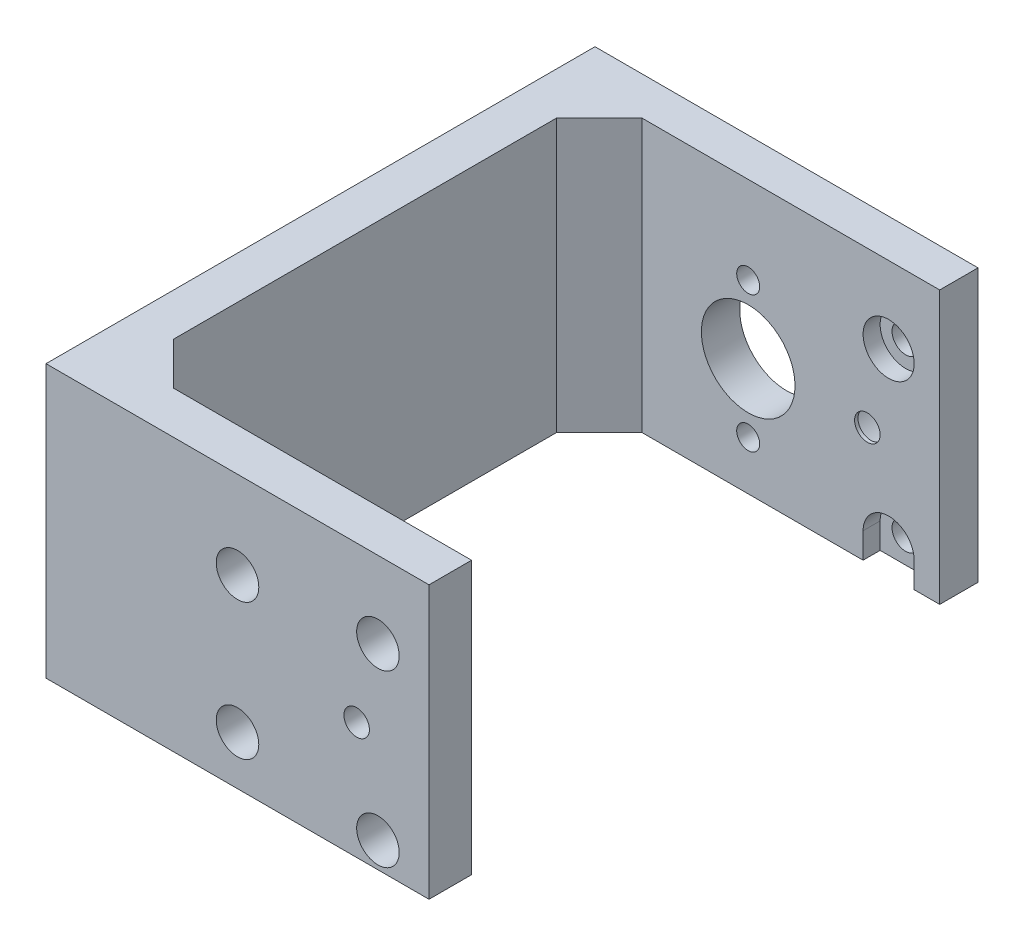
ISO-10303-21;
HEADER;
FILE_DESCRIPTION(('STEP AP214'),'2;1');
FILE_NAME('part.step','',(''),(''),'','','');
FILE_SCHEMA(('AUTOMOTIVE_DESIGN { 1 0 10303 214 1 1 1 1 }'));
ENDSEC;
DATA;
#1=APPLICATION_CONTEXT('core data for automotive mechanical design processes');
#2=APPLICATION_PROTOCOL_DEFINITION('international standard','automotive_design',2000,#1);
#3=PRODUCT_CONTEXT('',#1,'mechanical');
#4=PRODUCT('Part','Part','',(#3));
#5=PRODUCT_RELATED_PRODUCT_CATEGORY('part','',(#4));
#6=PRODUCT_DEFINITION_FORMATION('','',#4);
#7=PRODUCT_DEFINITION_CONTEXT('part definition',#1,'design');
#8=PRODUCT_DEFINITION('design','',#6,#7);
#9=PRODUCT_DEFINITION_SHAPE('','',#8);
#10=(LENGTH_UNIT() NAMED_UNIT(*) SI_UNIT(.MILLI.,.METRE.));
#11=(NAMED_UNIT(*) PLANE_ANGLE_UNIT() SI_UNIT($,.RADIAN.));
#12=(NAMED_UNIT(*) SI_UNIT($,.STERADIAN.) SOLID_ANGLE_UNIT());
#13=UNCERTAINTY_MEASURE_WITH_UNIT(LENGTH_MEASURE(1.E-05),#10,'distance_accuracy_value','');
#14=(GEOMETRIC_REPRESENTATION_CONTEXT(3) GLOBAL_UNCERTAINTY_ASSIGNED_CONTEXT((#13)) GLOBAL_UNIT_ASSIGNED_CONTEXT((#10,
#11,#12)) REPRESENTATION_CONTEXT('',''));
#15=CARTESIAN_POINT('',(0.,0.,0.));
#16=DIRECTION('',(0.,0.,1.));
#17=DIRECTION('',(1.,0.,0.));
#18=AXIS2_PLACEMENT_3D('',#15,#16,#17);
#19=CARTESIAN_POINT('',(-7.5,0.,64.5));
#20=DIRECTION('',(-1.,0.,0.));
#21=DIRECTION('',(0.,0.,1.));
#22=AXIS2_PLACEMENT_3D('',#19,#20,#21);
#23=PLANE('',#22);
#24=DIRECTION('',(0.,0.,-1.));
#25=VECTOR('',#24,1.);
#26=CARTESIAN_POINT('',(-7.5,32.,64.5));
#27=LINE('',#26,#25);
#28=CARTESIAN_POINT('',(-7.5,32.,54.5));
#29=VERTEX_POINT('',#28);
#30=CARTESIAN_POINT('',(-7.5,32.,9.50000000000004));
#31=VERTEX_POINT('',#30);
#32=EDGE_CURVE('E183',#29,#31,#27,.T.);
#33=ORIENTED_EDGE('',*,*,#32,.F.);
#34=DIRECTION('',(0.,-1.,0.));
#35=VECTOR('',#34,1.);
#36=CARTESIAN_POINT('',(-7.5,0.,54.5));
#37=LINE('',#36,#35);
#38=CARTESIAN_POINT('',(-7.5,0.,54.5));
#39=VERTEX_POINT('',#38);
#40=EDGE_CURVE('E296',#29,#39,#37,.T.);
#41=ORIENTED_EDGE('',*,*,#40,.T.);
#42=DIRECTION('',(0.,0.,-1.));
#43=VECTOR('',#42,1.);
#44=CARTESIAN_POINT('',(-7.5,0.,64.5));
#45=LINE('',#44,#43);
#46=CARTESIAN_POINT('',(-7.5,0.,9.50000000000004));
#47=VERTEX_POINT('',#46);
#48=EDGE_CURVE('E187',#39,#47,#45,.T.);
#49=ORIENTED_EDGE('',*,*,#48,.T.);
#50=DIRECTION('',(0.,1.,0.));
#51=VECTOR('',#50,1.);
#52=CARTESIAN_POINT('',(-7.5,0.,9.50000000000004));
#53=LINE('',#52,#51);
#54=EDGE_CURVE('E294',#47,#31,#53,.T.);
#55=ORIENTED_EDGE('',*,*,#54,.T.);
#56=EDGE_LOOP('',(#33,#41,#49,#55));
#57=FACE_BOUND('',#56,.T.);
#58=ADVANCED_FACE('F41',(#57),#23,.F.);
#59=CARTESIAN_POINT('',(26.5,3.,-5.5));
#60=DIRECTION('',(0.,0.,1.));
#61=DIRECTION('',(1.,0.,0.));
#62=AXIS2_PLACEMENT_3D('',#59,#60,#61);
#63=CYLINDRICAL_SURFACE('',#62,1.6);
#64=CARTESIAN_POINT('',(26.5,3.,0.));
#65=DIRECTION('',(0.,0.,1.));
#66=DIRECTION('',(1.,0.,0.));
#67=AXIS2_PLACEMENT_3D('',#64,#65,#66);
#68=CIRCLE('',#67,1.6);
#69=CARTESIAN_POINT('',(28.1,3.,0.));
#70=VERTEX_POINT('',#69);
#71=EDGE_CURVE('E279',#70,#70,#68,.T.);
#72=ORIENTED_EDGE('',*,*,#71,.F.);
#73=EDGE_LOOP('',(#72));
#74=FACE_BOUND('',#73,.T.);
#75=CARTESIAN_POINT('',(26.5,3.,2.5));
#76=DIRECTION('',(0.,0.,1.));
#77=DIRECTION('',(1.,0.,0.));
#78=AXIS2_PLACEMENT_3D('',#75,#76,#77);
#79=CIRCLE('',#78,1.6);
#80=CARTESIAN_POINT('',(28.1,3.,2.5));
#81=VERTEX_POINT('',#80);
#82=EDGE_CURVE('E229',#81,#81,#79,.F.);
#83=ORIENTED_EDGE('',*,*,#82,.F.);
#84=EDGE_LOOP('',(#83));
#85=FACE_BOUND('',#84,.T.);
#86=ADVANCED_FACE('F360',(#74,#85),#63,.F.);
#87=CARTESIAN_POINT('',(26.5,23.,-5.5));
#88=DIRECTION('',(0.,0.,1.));
#89=DIRECTION('',(1.,0.,0.));
#90=AXIS2_PLACEMENT_3D('',#87,#88,#89);
#91=CYLINDRICAL_SURFACE('',#90,1.6);
#92=CARTESIAN_POINT('',(26.5,23.,0.));
#93=DIRECTION('',(0.,0.,1.));
#94=DIRECTION('',(1.,0.,0.));
#95=AXIS2_PLACEMENT_3D('',#92,#93,#94);
#96=CIRCLE('',#95,1.6);
#97=CARTESIAN_POINT('',(28.1,23.,0.));
#98=VERTEX_POINT('',#97);
#99=EDGE_CURVE('E248',#98,#98,#96,.T.);
#100=ORIENTED_EDGE('',*,*,#99,.F.);
#101=EDGE_LOOP('',(#100));
#102=FACE_BOUND('',#101,.T.);
#103=CARTESIAN_POINT('',(26.5,23.,2.5));
#104=DIRECTION('',(0.,0.,1.));
#105=DIRECTION('',(1.,0.,0.));
#106=AXIS2_PLACEMENT_3D('',#103,#104,#105);
#107=CIRCLE('',#106,1.6);
#108=CARTESIAN_POINT('',(28.1,23.,2.5));
#109=VERTEX_POINT('',#108);
#110=EDGE_CURVE('E191',#109,#109,#107,.F.);
#111=ORIENTED_EDGE('',*,*,#110,.F.);
#112=EDGE_LOOP('',(#111));
#113=FACE_BOUND('',#112,.T.);
#114=ADVANCED_FACE('F366',(#102,#113),#91,.F.);
#115=CARTESIAN_POINT('',(24.,13.75,4.5));
#116=DIRECTION('',(0.,0.,-1.));
#117=DIRECTION('',(-1.,0.,0.));
#118=AXIS2_PLACEMENT_3D('',#115,#116,#117);
#119=CYLINDRICAL_SURFACE('',#118,4.45);
#120=CARTESIAN_POINT('',(24.,13.75,0.));
#121=DIRECTION('',(0.,0.,1.));
#122=DIRECTION('',(1.,0.,0.));
#123=AXIS2_PLACEMENT_3D('',#120,#121,#122);
#124=CIRCLE('',#123,4.45);
#125=CARTESIAN_POINT('',(28.45,13.75,0.));
#126=VERTEX_POINT('',#125);
#127=EDGE_CURVE('E255',#126,#126,#124,.T.);
#128=ORIENTED_EDGE('',*,*,#127,.F.);
#129=EDGE_LOOP('',(#128));
#130=FACE_BOUND('',#129,.T.);
#131=CARTESIAN_POINT('',(24.,13.75,4.1));
#132=DIRECTION('',(0.,0.,1.));
#133=DIRECTION('',(1.,0.,0.));
#134=AXIS2_PLACEMENT_3D('',#131,#132,#133);
#135=CIRCLE('',#134,4.45);
#136=CARTESIAN_POINT('',(28.45,13.75,4.1));
#137=VERTEX_POINT('',#136);
#138=EDGE_CURVE('E244',#137,#137,#135,.T.);
#139=ORIENTED_EDGE('',*,*,#138,.T.);
#140=EDGE_LOOP('',(#139));
#141=FACE_BOUND('',#140,.T.);
#142=ADVANCED_FACE('F405',(#130,#141),#119,.F.);
#143=CARTESIAN_POINT('',(0.,0.,4.5));
#144=DIRECTION('',(0.,0.,1.));
#145=DIRECTION('',(1.,0.,0.));
#146=AXIS2_PLACEMENT_3D('',#143,#144,#145);
#147=PLANE('',#146);
#148=DIRECTION('',(-1.,0.,0.));
#149=VECTOR('',#148,1.);
#150=CARTESIAN_POINT('',(-12.5,32.,4.5));
#151=LINE('',#150,#149);
#152=CARTESIAN_POINT('',(32.5,32.,4.5));
#153=VERTEX_POINT('',#152);
#154=CARTESIAN_POINT('',(-2.50000000000001,32.,4.5));
#155=VERTEX_POINT('',#154);
#156=EDGE_CURVE('E226',#153,#155,#151,.T.);
#157=ORIENTED_EDGE('',*,*,#156,.T.);
#158=DIRECTION('',(0.,-1.,0.));
#159=VECTOR('',#158,1.);
#160=CARTESIAN_POINT('',(-2.50000000000001,0.,4.5));
#161=LINE('',#160,#159);
#162=CARTESIAN_POINT('',(-2.50000000000001,0.,4.5));
#163=VERTEX_POINT('',#162);
#164=EDGE_CURVE('E61',#155,#163,#161,.T.);
#165=ORIENTED_EDGE('',*,*,#164,.T.);
#166=DIRECTION('',(1.,0.,0.));
#167=VECTOR('',#166,1.);
#168=CARTESIAN_POINT('',(-12.5,0.,4.5));
#169=LINE('',#168,#167);
#170=CARTESIAN_POINT('',(23.5,0.,4.5));
#171=VERTEX_POINT('',#170);
#172=EDGE_CURVE('E265',#163,#171,#169,.T.);
#173=ORIENTED_EDGE('',*,*,#172,.T.);
#174=DIRECTION('',(0.,-1.,0.));
#175=VECTOR('',#174,1.);
#176=CARTESIAN_POINT('',(23.5,3.,4.5));
#177=LINE('',#176,#175);
#178=CARTESIAN_POINT('',(23.5,3.,4.5));
#179=VERTEX_POINT('',#178);
#180=EDGE_CURVE('E208',#179,#171,#177,.T.);
#181=ORIENTED_EDGE('',*,*,#180,.F.);
#182=CARTESIAN_POINT('',(26.5,3.,4.5));
#183=DIRECTION('',(0.,0.,1.));
#184=DIRECTION('',(1.,0.,0.));
#185=AXIS2_PLACEMENT_3D('',#182,#183,#184);
#186=CIRCLE('',#185,3.);
#187=CARTESIAN_POINT('',(29.5,3.,4.5));
#188=VERTEX_POINT('',#187);
#189=EDGE_CURVE('E200',#188,#179,#186,.T.);
#190=ORIENTED_EDGE('',*,*,#189,.F.);
#191=DIRECTION('',(0.,1.,0.));
#192=VECTOR('',#191,1.);
#193=CARTESIAN_POINT('',(29.5,0.,4.5));
#194=LINE('',#193,#192);
#195=CARTESIAN_POINT('',(29.5,0.,4.5));
#196=VERTEX_POINT('',#195);
#197=EDGE_CURVE('E210',#196,#188,#194,.T.);
#198=ORIENTED_EDGE('',*,*,#197,.F.);
#199=CARTESIAN_POINT('',(32.5,0.,4.5));
#200=VERTEX_POINT('',#199);
#201=EDGE_CURVE('E264',#196,#200,#169,.T.);
#202=ORIENTED_EDGE('',*,*,#201,.T.);
#203=DIRECTION('',(0.,1.,0.));
#204=VECTOR('',#203,1.);
#205=CARTESIAN_POINT('',(32.5,27.5,4.5));
#206=LINE('',#205,#204);
#207=EDGE_CURVE('E262',#200,#153,#206,.T.);
#208=ORIENTED_EDGE('',*,*,#207,.T.);
#209=EDGE_LOOP('',(#157,#165,#173,#181,#190,#198,#202,#208));
#210=FACE_BOUND('',#209,.T.);
#211=CARTESIAN_POINT('',(26.5,23.,4.5));
#212=DIRECTION('',(0.,0.,1.));
#213=DIRECTION('',(1.,0.,0.));
#214=AXIS2_PLACEMENT_3D('',#211,#212,#213);
#215=CIRCLE('',#214,3.);
#216=CARTESIAN_POINT('',(29.5,23.,4.5));
#217=VERTEX_POINT('',#216);
#218=EDGE_CURVE('E194',#217,#217,#215,.T.);
#219=ORIENTED_EDGE('',*,*,#218,.F.);
#220=EDGE_LOOP('',(#219));
#221=FACE_BOUND('',#220,.T.);
#222=CARTESIAN_POINT('',(10.,21.75,4.5));
#223=DIRECTION('',(0.,0.,1.));
#224=DIRECTION('',(1.,0.,0.));
#225=AXIS2_PLACEMENT_3D('',#222,#223,#224);
#226=CIRCLE('',#225,1.35);
#227=CARTESIAN_POINT('',(11.35,21.75,4.5));
#228=VERTEX_POINT('',#227);
#229=EDGE_CURVE('E236',#228,#228,#226,.T.);
#230=ORIENTED_EDGE('',*,*,#229,.F.);
#231=EDGE_LOOP('',(#230));
#232=FACE_BOUND('',#231,.T.);
#233=CARTESIAN_POINT('',(10.,5.75,4.5));
#234=DIRECTION('',(0.,0.,1.));
#235=DIRECTION('',(1.,0.,0.));
#236=AXIS2_PLACEMENT_3D('',#233,#234,#235);
#237=CIRCLE('',#236,1.35);
#238=CARTESIAN_POINT('',(11.35,5.75,4.5));
#239=VERTEX_POINT('',#238);
#240=EDGE_CURVE('E231',#239,#239,#237,.T.);
#241=ORIENTED_EDGE('',*,*,#240,.F.);
#242=EDGE_LOOP('',(#241));
#243=FACE_BOUND('',#242,.T.);
#244=CARTESIAN_POINT('',(10.,13.75,4.5));
#245=DIRECTION('',(0.,0.,1.));
#246=DIRECTION('',(1.,0.,0.));
#247=AXIS2_PLACEMENT_3D('',#244,#245,#246);
#248=CIRCLE('',#247,5.5);
#249=CARTESIAN_POINT('',(15.5,13.75,4.5));
#250=VERTEX_POINT('',#249);
#251=EDGE_CURVE('E258',#250,#250,#248,.T.);
#252=ORIENTED_EDGE('',*,*,#251,.F.);
#253=EDGE_LOOP('',(#252));
#254=FACE_BOUND('',#253,.T.);
#255=CARTESIAN_POINT('',(24.,13.75,4.5));
#256=DIRECTION('',(0.,0.,1.));
#257=DIRECTION('',(1.,0.,0.));
#258=AXIS2_PLACEMENT_3D('',#255,#256,#257);
#259=CIRCLE('',#258,1.5);
#260=CARTESIAN_POINT('',(25.5,13.75,4.5));
#261=VERTEX_POINT('',#260);
#262=EDGE_CURVE('E246',#261,#261,#259,.T.);
#263=ORIENTED_EDGE('',*,*,#262,.F.);
#264=EDGE_LOOP('',(#263));
#265=FACE_BOUND('',#264,.T.);
#266=ADVANCED_FACE('F323',(#210,#221,#232,#243,#254,#265),#147,.T.);
#267=CARTESIAN_POINT('',(0.,0.,0.));
#268=DIRECTION('',(0.,0.,1.));
#269=DIRECTION('',(1.,0.,0.));
#270=AXIS2_PLACEMENT_3D('',#267,#268,#269);
#271=PLANE('',#270);
#272=CARTESIAN_POINT('',(10.,21.75,0.));
#273=DIRECTION('',(0.,0.,1.));
#274=DIRECTION('',(1.,0.,0.));
#275=AXIS2_PLACEMENT_3D('',#272,#273,#274);
#276=CIRCLE('',#275,1.35);
#277=CARTESIAN_POINT('',(11.35,21.75,0.));
#278=VERTEX_POINT('',#277);
#279=EDGE_CURVE('E285',#278,#278,#276,.T.);
#280=ORIENTED_EDGE('',*,*,#279,.T.);
#281=EDGE_LOOP('',(#280));
#282=FACE_BOUND('',#281,.T.);
#283=CARTESIAN_POINT('',(10.,5.75,0.));
#284=DIRECTION('',(0.,0.,1.));
#285=DIRECTION('',(1.,0.,0.));
#286=AXIS2_PLACEMENT_3D('',#283,#284,#285);
#287=CIRCLE('',#286,1.35);
#288=CARTESIAN_POINT('',(11.35,5.75,0.));
#289=VERTEX_POINT('',#288);
#290=EDGE_CURVE('E237',#289,#289,#287,.T.);
#291=ORIENTED_EDGE('',*,*,#290,.T.);
#292=EDGE_LOOP('',(#291));
#293=FACE_BOUND('',#292,.T.);
#294=ORIENTED_EDGE('',*,*,#99,.T.);
#295=EDGE_LOOP('',(#294));
#296=FACE_BOUND('',#295,.T.);
#297=ORIENTED_EDGE('',*,*,#71,.T.);
#298=EDGE_LOOP('',(#297));
#299=FACE_BOUND('',#298,.T.);
#300=DIRECTION('',(0.,-1.,0.));
#301=VECTOR('',#300,1.);
#302=CARTESIAN_POINT('',(-12.5,27.5,0.));
#303=LINE('',#302,#301);
#304=CARTESIAN_POINT('',(-12.5,32.,0.));
#305=VERTEX_POINT('',#304);
#306=CARTESIAN_POINT('',(-12.5,0.,0.));
#307=VERTEX_POINT('',#306);
#308=EDGE_CURVE('E259',#305,#307,#303,.T.);
#309=ORIENTED_EDGE('',*,*,#308,.F.);
#310=DIRECTION('',(-1.,0.,0.));
#311=VECTOR('',#310,1.);
#312=CARTESIAN_POINT('',(-12.5,32.,0.));
#313=LINE('',#312,#311);
#314=CARTESIAN_POINT('',(32.5,32.,0.));
#315=VERTEX_POINT('',#314);
#316=EDGE_CURVE('E221',#315,#305,#313,.T.);
#317=ORIENTED_EDGE('',*,*,#316,.F.);
#318=DIRECTION('',(0.,1.,0.));
#319=VECTOR('',#318,1.);
#320=CARTESIAN_POINT('',(32.5,27.5,0.));
#321=LINE('',#320,#319);
#322=CARTESIAN_POINT('',(32.5,0.,0.));
#323=VERTEX_POINT('',#322);
#324=EDGE_CURVE('E275',#323,#315,#321,.T.);
#325=ORIENTED_EDGE('',*,*,#324,.F.);
#326=DIRECTION('',(1.,0.,0.));
#327=VECTOR('',#326,1.);
#328=CARTESIAN_POINT('',(0.,0.,0.));
#329=LINE('',#328,#327);
#330=EDGE_CURVE('E268',#307,#323,#329,.T.);
#331=ORIENTED_EDGE('',*,*,#330,.F.);
#332=EDGE_LOOP('',(#309,#317,#325,#331));
#333=FACE_BOUND('',#332,.T.);
#334=CARTESIAN_POINT('',(10.,13.75,0.));
#335=DIRECTION('',(0.,0.,1.));
#336=DIRECTION('',(1.,0.,0.));
#337=AXIS2_PLACEMENT_3D('',#334,#335,#336);
#338=CIRCLE('',#337,5.5);
#339=CARTESIAN_POINT('',(15.5,13.75,0.));
#340=VERTEX_POINT('',#339);
#341=EDGE_CURVE('E253',#340,#340,#338,.T.);
#342=ORIENTED_EDGE('',*,*,#341,.T.);
#343=EDGE_LOOP('',(#342));
#344=FACE_BOUND('',#343,.T.);
#345=ORIENTED_EDGE('',*,*,#127,.T.);
#346=EDGE_LOOP('',(#345));
#347=FACE_BOUND('',#346,.T.);
#348=ADVANCED_FACE('F345',(#282,#293,#296,#299,#333,#344,#347),#271,.F.);
#349=CARTESIAN_POINT('',(-12.5,27.5,4.5));
#350=DIRECTION('',(1.,0.,0.));
#351=DIRECTION('',(0.,1.,0.));
#352=AXIS2_PLACEMENT_3D('',#349,#350,#351);
#353=PLANE('',#352);
#354=ORIENTED_EDGE('',*,*,#308,.T.);
#355=DIRECTION('',(0.,0.,-1.));
#356=VECTOR('',#355,1.);
#357=CARTESIAN_POINT('',(-12.5,0.,4.5));
#358=LINE('',#357,#356);
#359=CARTESIAN_POINT('',(-12.5,0.,64.5));
#360=VERTEX_POINT('',#359);
#361=EDGE_CURVE('E278',#360,#307,#358,.T.);
#362=ORIENTED_EDGE('',*,*,#361,.F.);
#363=DIRECTION('',(0.,-1.,0.));
#364=VECTOR('',#363,1.);
#365=CARTESIAN_POINT('',(-12.5,0.,64.5));
#366=LINE('',#365,#364);
#367=CARTESIAN_POINT('',(-12.5,32.,64.5));
#368=VERTEX_POINT('',#367);
#369=EDGE_CURVE('E147',#368,#360,#366,.T.);
#370=ORIENTED_EDGE('',*,*,#369,.F.);
#371=DIRECTION('',(0.,0.,1.));
#372=VECTOR('',#371,1.);
#373=CARTESIAN_POINT('',(-12.5,32.,0.));
#374=LINE('',#373,#372);
#375=EDGE_CURVE('E233',#305,#368,#374,.T.);
#376=ORIENTED_EDGE('',*,*,#375,.F.);
#377=EDGE_LOOP('',(#354,#362,#370,#376));
#378=FACE_BOUND('',#377,.T.);
#379=ADVANCED_FACE('F346',(#378),#353,.F.);
#380=CARTESIAN_POINT('',(0.,0.,4.5));
#381=DIRECTION('',(0.,1.,0.));
#382=DIRECTION('',(-1.,0.,0.));
#383=AXIS2_PLACEMENT_3D('',#380,#381,#382);
#384=PLANE('',#383);
#385=DIRECTION('',(1.,0.,0.));
#386=VECTOR('',#385,1.);
#387=CARTESIAN_POINT('',(23.5,0.,2.5));
#388=LINE('',#387,#386);
#389=CARTESIAN_POINT('',(23.5,0.,2.5));
#390=VERTEX_POINT('',#389);
#391=CARTESIAN_POINT('',(29.5,0.,2.5));
#392=VERTEX_POINT('',#391);
#393=EDGE_CURVE('E218',#390,#392,#388,.T.);
#394=ORIENTED_EDGE('',*,*,#393,.F.);
#395=DIRECTION('',(0.,0.,1.));
#396=VECTOR('',#395,1.);
#397=CARTESIAN_POINT('',(23.5,0.,2.5));
#398=LINE('',#397,#396);
#399=EDGE_CURVE('E202',#390,#171,#398,.T.);
#400=ORIENTED_EDGE('',*,*,#399,.T.);
#401=ORIENTED_EDGE('',*,*,#172,.F.);
#402=DIRECTION('',(-0.707106781186544,0.,0.707106781186551));
#403=VECTOR('',#402,1.);
#404=CARTESIAN_POINT('',(-1.25000000000002,0.,3.24999999999999));
#405=LINE('',#404,#403);
#406=EDGE_CURVE('E11',#163,#47,#405,.T.);
#407=ORIENTED_EDGE('',*,*,#406,.T.);
#408=ORIENTED_EDGE('',*,*,#48,.F.);
#409=DIRECTION('',(-0.707106781186551,0.,-0.707106781186544));
#410=VECTOR('',#409,1.);
#411=CARTESIAN_POINT('',(-28.75,0.,33.2500000000002));
#412=LINE('',#411,#410);
#413=CARTESIAN_POINT('',(-2.49999999999998,0.,59.5));
#414=VERTEX_POINT('',#413);
#415=EDGE_CURVE('E303',#39,#414,#412,.F.);
#416=ORIENTED_EDGE('',*,*,#415,.T.);
#417=DIRECTION('',(-1.,0.,0.));
#418=VECTOR('',#417,1.);
#419=CARTESIAN_POINT('',(32.5,0.,59.5));
#420=LINE('',#419,#418);
#421=CARTESIAN_POINT('',(32.5,0.,59.5));
#422=VERTEX_POINT('',#421);
#423=EDGE_CURVE('E158',#422,#414,#420,.T.);
#424=ORIENTED_EDGE('',*,*,#423,.F.);
#425=DIRECTION('',(0.,0.,-1.));
#426=VECTOR('',#425,1.);
#427=CARTESIAN_POINT('',(32.5,0.,64.5));
#428=LINE('',#427,#426);
#429=CARTESIAN_POINT('',(32.5,0.,64.5));
#430=VERTEX_POINT('',#429);
#431=EDGE_CURVE('E157',#430,#422,#428,.T.);
#432=ORIENTED_EDGE('',*,*,#431,.F.);
#433=DIRECTION('',(1.,0.,0.));
#434=VECTOR('',#433,1.);
#435=CARTESIAN_POINT('',(-12.5,0.,64.5));
#436=LINE('',#435,#434);
#437=EDGE_CURVE('E141',#360,#430,#436,.T.);
#438=ORIENTED_EDGE('',*,*,#437,.F.);
#439=ORIENTED_EDGE('',*,*,#361,.T.);
#440=ORIENTED_EDGE('',*,*,#330,.T.);
#441=DIRECTION('',(0.,0.,-1.));
#442=VECTOR('',#441,1.);
#443=CARTESIAN_POINT('',(32.5,0.,4.5));
#444=LINE('',#443,#442);
#445=EDGE_CURVE('E269',#200,#323,#444,.T.);
#446=ORIENTED_EDGE('',*,*,#445,.F.);
#447=ORIENTED_EDGE('',*,*,#201,.F.);
#448=DIRECTION('',(0.,0.,1.));
#449=VECTOR('',#448,1.);
#450=CARTESIAN_POINT('',(29.5,0.,2.5));
#451=LINE('',#450,#449);
#452=EDGE_CURVE('E201',#392,#196,#451,.T.);
#453=ORIENTED_EDGE('',*,*,#452,.F.);
#454=EDGE_LOOP('',(#394,#400,#401,#407,#408,#416,#424,#432,#438,#439,#440,#446,#447,#453));
#455=FACE_BOUND('',#454,.T.);
#456=ADVANCED_FACE('F160',(#455),#384,.F.);
#457=CARTESIAN_POINT('',(32.5,27.5,4.5));
#458=DIRECTION('',(-1.,0.,0.));
#459=DIRECTION('',(0.,-1.,0.));
#460=AXIS2_PLACEMENT_3D('',#457,#458,#459);
#461=PLANE('',#460);
#462=ORIENTED_EDGE('',*,*,#324,.T.);
#463=DIRECTION('',(0.,0.,1.));
#464=VECTOR('',#463,1.);
#465=CARTESIAN_POINT('',(32.5,32.,0.));
#466=LINE('',#465,#464);
#467=EDGE_CURVE('E227',#315,#153,#466,.T.);
#468=ORIENTED_EDGE('',*,*,#467,.T.);
#469=ORIENTED_EDGE('',*,*,#207,.F.);
#470=ORIENTED_EDGE('',*,*,#445,.T.);
#471=EDGE_LOOP('',(#462,#468,#469,#470));
#472=FACE_BOUND('',#471,.T.);
#473=ADVANCED_FACE('F336',(#472),#461,.F.);
#474=CARTESIAN_POINT('',(10.,13.75,4.5));
#475=DIRECTION('',(0.,0.,-1.));
#476=DIRECTION('',(-1.,0.,0.));
#477=AXIS2_PLACEMENT_3D('',#474,#475,#476);
#478=CYLINDRICAL_SURFACE('',#477,5.5);
#479=ORIENTED_EDGE('',*,*,#251,.T.);
#480=EDGE_LOOP('',(#479));
#481=FACE_BOUND('',#480,.T.);
#482=ORIENTED_EDGE('',*,*,#341,.F.);
#483=EDGE_LOOP('',(#482));
#484=FACE_BOUND('',#483,.T.);
#485=ADVANCED_FACE('F411',(#481,#484),#478,.F.);
#486=CARTESIAN_POINT('',(24.,13.75,4.1));
#487=DIRECTION('',(0.,0.,1.));
#488=DIRECTION('',(1.,0.,0.));
#489=AXIS2_PLACEMENT_3D('',#486,#487,#488);
#490=PLANE('',#489);
#491=CARTESIAN_POINT('',(24.,13.75,4.1));
#492=DIRECTION('',(0.,0.,1.));
#493=DIRECTION('',(1.,0.,0.));
#494=AXIS2_PLACEMENT_3D('',#491,#492,#493);
#495=CIRCLE('',#494,1.5);
#496=CARTESIAN_POINT('',(25.5,13.75,4.1));
#497=VERTEX_POINT('',#496);
#498=EDGE_CURVE('E245',#497,#497,#495,.T.);
#499=ORIENTED_EDGE('',*,*,#498,.T.);
#500=EDGE_LOOP('',(#499));
#501=FACE_BOUND('',#500,.T.);
#502=ORIENTED_EDGE('',*,*,#138,.F.);
#503=EDGE_LOOP('',(#502));
#504=FACE_BOUND('',#503,.T.);
#505=ADVANCED_FACE('F410',(#501,#504),#490,.F.);
#506=CARTESIAN_POINT('',(24.,13.75,4.1));
#507=DIRECTION('',(0.,0.,1.));
#508=DIRECTION('',(1.,0.,0.));
#509=AXIS2_PLACEMENT_3D('',#506,#507,#508);
#510=CYLINDRICAL_SURFACE('',#509,1.5);
#511=ORIENTED_EDGE('',*,*,#498,.F.);
#512=EDGE_LOOP('',(#511));
#513=FACE_BOUND('',#512,.T.);
#514=ORIENTED_EDGE('',*,*,#262,.T.);
#515=EDGE_LOOP('',(#514));
#516=FACE_BOUND('',#515,.T.);
#517=ADVANCED_FACE('F396',(#513,#516),#510,.F.);
#518=CARTESIAN_POINT('',(10.,5.75,-5.5));
#519=DIRECTION('',(0.,0.,1.));
#520=DIRECTION('',(1.,0.,0.));
#521=AXIS2_PLACEMENT_3D('',#518,#519,#520);
#522=CYLINDRICAL_SURFACE('',#521,1.35);
#523=ORIENTED_EDGE('',*,*,#240,.T.);
#524=EDGE_LOOP('',(#523));
#525=FACE_BOUND('',#524,.T.);
#526=ORIENTED_EDGE('',*,*,#290,.F.);
#527=EDGE_LOOP('',(#526));
#528=FACE_BOUND('',#527,.T.);
#529=ADVANCED_FACE('F394',(#525,#528),#522,.F.);
#530=CARTESIAN_POINT('',(10.,21.75,-5.5));
#531=DIRECTION('',(0.,0.,1.));
#532=DIRECTION('',(1.,0.,0.));
#533=AXIS2_PLACEMENT_3D('',#530,#531,#532);
#534=CYLINDRICAL_SURFACE('',#533,1.35);
#535=ORIENTED_EDGE('',*,*,#229,.T.);
#536=EDGE_LOOP('',(#535));
#537=FACE_BOUND('',#536,.T.);
#538=ORIENTED_EDGE('',*,*,#279,.F.);
#539=EDGE_LOOP('',(#538));
#540=FACE_BOUND('',#539,.T.);
#541=ADVANCED_FACE('F395',(#537,#540),#534,.F.);
#542=CARTESIAN_POINT('',(-12.5,32.,0.));
#543=DIRECTION('',(0.,1.,0.));
#544=DIRECTION('',(0.,0.,1.));
#545=AXIS2_PLACEMENT_3D('',#542,#543,#544);
#546=PLANE('',#545);
#547=ORIENTED_EDGE('',*,*,#156,.F.);
#548=ORIENTED_EDGE('',*,*,#467,.F.);
#549=ORIENTED_EDGE('',*,*,#316,.T.);
#550=ORIENTED_EDGE('',*,*,#375,.T.);
#551=DIRECTION('',(-1.,0.,0.));
#552=VECTOR('',#551,1.);
#553=CARTESIAN_POINT('',(-12.5,32.,64.5));
#554=LINE('',#553,#552);
#555=CARTESIAN_POINT('',(32.5,32.,64.5));
#556=VERTEX_POINT('',#555);
#557=EDGE_CURVE('E153',#556,#368,#554,.T.);
#558=ORIENTED_EDGE('',*,*,#557,.F.);
#559=DIRECTION('',(0.,0.,1.));
#560=VECTOR('',#559,1.);
#561=CARTESIAN_POINT('',(32.5,32.,64.5));
#562=LINE('',#561,#560);
#563=CARTESIAN_POINT('',(32.5,32.,59.5));
#564=VERTEX_POINT('',#563);
#565=EDGE_CURVE('E166',#564,#556,#562,.T.);
#566=ORIENTED_EDGE('',*,*,#565,.F.);
#567=DIRECTION('',(-1.,0.,0.));
#568=VECTOR('',#567,1.);
#569=CARTESIAN_POINT('',(32.5,32.,59.5));
#570=LINE('',#569,#568);
#571=CARTESIAN_POINT('',(-2.49999999999998,32.,59.5));
#572=VERTEX_POINT('',#571);
#573=EDGE_CURVE('E178',#564,#572,#570,.T.);
#574=ORIENTED_EDGE('',*,*,#573,.T.);
#575=DIRECTION('',(0.707106781186551,0.,0.707106781186544));
#576=VECTOR('',#575,1.);
#577=CARTESIAN_POINT('',(-2.49999999999998,32.,59.5));
#578=LINE('',#577,#576);
#579=EDGE_CURVE('E301',#572,#29,#578,.F.);
#580=ORIENTED_EDGE('',*,*,#579,.T.);
#581=ORIENTED_EDGE('',*,*,#32,.T.);
#582=DIRECTION('',(0.707106781186544,0.,-0.707106781186551));
#583=VECTOR('',#582,1.);
#584=CARTESIAN_POINT('',(-7.5,32.,9.50000000000004));
#585=LINE('',#584,#583);
#586=EDGE_CURVE('E49',#31,#155,#585,.T.);
#587=ORIENTED_EDGE('',*,*,#586,.T.);
#588=EDGE_LOOP('',(#547,#548,#549,#550,#558,#566,#574,#580,#581,#587));
#589=FACE_BOUND('',#588,.T.);
#590=ADVANCED_FACE('F313',(#589),#546,.T.);
#591=CARTESIAN_POINT('',(26.5,23.,2.5));
#592=DIRECTION('',(0.,0.,1.));
#593=DIRECTION('',(1.,0.,0.));
#594=AXIS2_PLACEMENT_3D('',#591,#592,#593);
#595=PLANE('',#594);
#596=CARTESIAN_POINT('',(26.5,23.,2.5));
#597=DIRECTION('',(0.,0.,1.));
#598=DIRECTION('',(1.,0.,0.));
#599=AXIS2_PLACEMENT_3D('',#596,#597,#598);
#600=CIRCLE('',#599,3.);
#601=CARTESIAN_POINT('',(29.5,23.,2.5));
#602=VERTEX_POINT('',#601);
#603=EDGE_CURVE('E188',#602,#602,#600,.T.);
#604=ORIENTED_EDGE('',*,*,#603,.T.);
#605=EDGE_LOOP('',(#604));
#606=FACE_BOUND('',#605,.T.);
#607=ORIENTED_EDGE('',*,*,#110,.T.);
#608=EDGE_LOOP('',(#607));
#609=FACE_BOUND('',#608,.T.);
#610=ADVANCED_FACE('F375',(#606,#609),#595,.T.);
#611=CARTESIAN_POINT('',(26.5,23.,2.5));
#612=DIRECTION('',(0.,0.,1.));
#613=DIRECTION('',(1.,0.,0.));
#614=AXIS2_PLACEMENT_3D('',#611,#612,#613);
#615=CYLINDRICAL_SURFACE('',#614,3.);
#616=ORIENTED_EDGE('',*,*,#603,.F.);
#617=EDGE_LOOP('',(#616));
#618=FACE_BOUND('',#617,.T.);
#619=ORIENTED_EDGE('',*,*,#218,.T.);
#620=EDGE_LOOP('',(#619));
#621=FACE_BOUND('',#620,.T.);
#622=ADVANCED_FACE('F374',(#618,#621),#615,.F.);
#623=CARTESIAN_POINT('',(26.5,3.,2.5));
#624=DIRECTION('',(0.,0.,1.));
#625=DIRECTION('',(1.,0.,0.));
#626=AXIS2_PLACEMENT_3D('',#623,#624,#625);
#627=PLANE('',#626);
#628=CARTESIAN_POINT('',(26.5,3.,2.5));
#629=DIRECTION('',(0.,0.,1.));
#630=DIRECTION('',(1.,0.,0.));
#631=AXIS2_PLACEMENT_3D('',#628,#629,#630);
#632=CIRCLE('',#631,3.);
#633=CARTESIAN_POINT('',(29.5,3.,2.5));
#634=VERTEX_POINT('',#633);
#635=CARTESIAN_POINT('',(23.5,3.,2.5));
#636=VERTEX_POINT('',#635);
#637=EDGE_CURVE('E213',#634,#636,#632,.T.);
#638=ORIENTED_EDGE('',*,*,#637,.T.);
#639=DIRECTION('',(0.,-1.,0.));
#640=VECTOR('',#639,1.);
#641=CARTESIAN_POINT('',(23.5,3.,2.5));
#642=LINE('',#641,#640);
#643=EDGE_CURVE('E219',#636,#390,#642,.T.);
#644=ORIENTED_EDGE('',*,*,#643,.T.);
#645=ORIENTED_EDGE('',*,*,#393,.T.);
#646=DIRECTION('',(0.,1.,0.));
#647=VECTOR('',#646,1.);
#648=CARTESIAN_POINT('',(29.5,0.,2.5));
#649=LINE('',#648,#647);
#650=EDGE_CURVE('E199',#392,#634,#649,.T.);
#651=ORIENTED_EDGE('',*,*,#650,.T.);
#652=EDGE_LOOP('',(#638,#644,#645,#651));
#653=FACE_BOUND('',#652,.T.);
#654=ORIENTED_EDGE('',*,*,#82,.T.);
#655=EDGE_LOOP('',(#654));
#656=FACE_BOUND('',#655,.T.);
#657=ADVANCED_FACE('F378',(#653,#656),#627,.T.);
#658=CARTESIAN_POINT('',(26.5,3.,2.5));
#659=DIRECTION('',(0.,0.,1.));
#660=DIRECTION('',(1.,0.,0.));
#661=AXIS2_PLACEMENT_3D('',#658,#659,#660);
#662=CYLINDRICAL_SURFACE('',#661,3.);
#663=ORIENTED_EDGE('',*,*,#189,.T.);
#664=DIRECTION('',(0.,0.,1.));
#665=VECTOR('',#664,1.);
#666=CARTESIAN_POINT('',(23.5,3.,2.5));
#667=LINE('',#666,#665);
#668=EDGE_CURVE('E198',#636,#179,#667,.T.);
#669=ORIENTED_EDGE('',*,*,#668,.F.);
#670=ORIENTED_EDGE('',*,*,#637,.F.);
#671=DIRECTION('',(0.,0.,1.));
#672=VECTOR('',#671,1.);
#673=CARTESIAN_POINT('',(29.5,3.,2.5));
#674=LINE('',#673,#672);
#675=EDGE_CURVE('E186',#634,#188,#674,.T.);
#676=ORIENTED_EDGE('',*,*,#675,.T.);
#677=EDGE_LOOP('',(#663,#669,#670,#676));
#678=FACE_BOUND('',#677,.T.);
#679=ADVANCED_FACE('F327',(#678),#662,.F.);
#680=CARTESIAN_POINT('',(29.5,0.,2.5));
#681=DIRECTION('',(1.,0.,0.));
#682=DIRECTION('',(0.,0.,-1.));
#683=AXIS2_PLACEMENT_3D('',#680,#681,#682);
#684=PLANE('',#683);
#685=ORIENTED_EDGE('',*,*,#197,.T.);
#686=ORIENTED_EDGE('',*,*,#675,.F.);
#687=ORIENTED_EDGE('',*,*,#650,.F.);
#688=ORIENTED_EDGE('',*,*,#452,.T.);
#689=EDGE_LOOP('',(#685,#686,#687,#688));
#690=FACE_BOUND('',#689,.T.);
#691=ADVANCED_FACE('F384',(#690),#684,.F.);
#692=CARTESIAN_POINT('',(23.5,3.,2.5));
#693=DIRECTION('',(-1.,0.,0.));
#694=DIRECTION('',(0.,0.,1.));
#695=AXIS2_PLACEMENT_3D('',#692,#693,#694);
#696=PLANE('',#695);
#697=ORIENTED_EDGE('',*,*,#180,.T.);
#698=ORIENTED_EDGE('',*,*,#399,.F.);
#699=ORIENTED_EDGE('',*,*,#643,.F.);
#700=ORIENTED_EDGE('',*,*,#668,.T.);
#701=EDGE_LOOP('',(#697,#698,#699,#700));
#702=FACE_BOUND('',#701,.T.);
#703=ADVANCED_FACE('F322',(#702),#696,.F.);
#704=CARTESIAN_POINT('',(0.,0.,64.5));
#705=DIRECTION('',(0.,0.,-1.));
#706=DIRECTION('',(-1.,0.,0.));
#707=AXIS2_PLACEMENT_3D('',#704,#705,#706);
#708=PLANE('',#707);
#709=CARTESIAN_POINT('',(26.5,23.,64.5));
#710=DIRECTION('',(0.,0.,1.));
#711=DIRECTION('',(1.,0.,0.));
#712=AXIS2_PLACEMENT_3D('',#709,#710,#711);
#713=CIRCLE('',#712,2.5);
#714=CARTESIAN_POINT('',(29.,23.,64.5));
#715=VERTEX_POINT('',#714);
#716=EDGE_CURVE('E670',#715,#715,#713,.T.);
#717=ORIENTED_EDGE('',*,*,#716,.F.);
#718=EDGE_LOOP('',(#717));
#719=FACE_BOUND('',#718,.T.);
#720=CARTESIAN_POINT('',(26.5,3.,64.5));
#721=DIRECTION('',(0.,0.,1.));
#722=DIRECTION('',(1.,0.,0.));
#723=AXIS2_PLACEMENT_3D('',#720,#721,#722);
#724=CIRCLE('',#723,2.5);
#725=CARTESIAN_POINT('',(29.,3.,64.5));
#726=VERTEX_POINT('',#725);
#727=EDGE_CURVE('E667',#726,#726,#724,.T.);
#728=ORIENTED_EDGE('',*,*,#727,.F.);
#729=EDGE_LOOP('',(#728));
#730=FACE_BOUND('',#729,.T.);
#731=CARTESIAN_POINT('',(10.,5.75,64.5));
#732=DIRECTION('',(0.,0.,1.));
#733=DIRECTION('',(1.,0.,0.));
#734=AXIS2_PLACEMENT_3D('',#731,#732,#733);
#735=CIRCLE('',#734,2.5);
#736=CARTESIAN_POINT('',(12.5,5.75,64.5));
#737=VERTEX_POINT('',#736);
#738=EDGE_CURVE('E678',#737,#737,#735,.T.);
#739=ORIENTED_EDGE('',*,*,#738,.F.);
#740=EDGE_LOOP('',(#739));
#741=FACE_BOUND('',#740,.T.);
#742=CARTESIAN_POINT('',(24.,13.75,64.5));
#743=DIRECTION('',(0.,0.,1.));
#744=DIRECTION('',(1.,0.,0.));
#745=AXIS2_PLACEMENT_3D('',#742,#743,#744);
#746=CIRCLE('',#745,1.5);
#747=CARTESIAN_POINT('',(25.5,13.75,64.5));
#748=VERTEX_POINT('',#747);
#749=EDGE_CURVE('E689',#748,#748,#746,.T.);
#750=ORIENTED_EDGE('',*,*,#749,.F.);
#751=EDGE_LOOP('',(#750));
#752=FACE_BOUND('',#751,.T.);
#753=CARTESIAN_POINT('',(10.,21.75,64.5));
#754=DIRECTION('',(0.,0.,1.));
#755=DIRECTION('',(1.,0.,0.));
#756=AXIS2_PLACEMENT_3D('',#753,#754,#755);
#757=CIRCLE('',#756,2.5);
#758=CARTESIAN_POINT('',(12.5,21.75,64.5));
#759=VERTEX_POINT('',#758);
#760=EDGE_CURVE('E175',#759,#759,#757,.T.);
#761=ORIENTED_EDGE('',*,*,#760,.F.);
#762=EDGE_LOOP('',(#761));
#763=FACE_BOUND('',#762,.T.);
#764=ORIENTED_EDGE('',*,*,#369,.T.);
#765=ORIENTED_EDGE('',*,*,#437,.T.);
#766=DIRECTION('',(0.,-1.,0.));
#767=VECTOR('',#766,1.);
#768=CARTESIAN_POINT('',(32.5,0.,64.5));
#769=LINE('',#768,#767);
#770=EDGE_CURVE('E146',#556,#430,#769,.T.);
#771=ORIENTED_EDGE('',*,*,#770,.F.);
#772=ORIENTED_EDGE('',*,*,#557,.T.);
#773=EDGE_LOOP('',(#764,#765,#771,#772));
#774=FACE_BOUND('',#773,.T.);
#775=ADVANCED_FACE('F143',(#719,#730,#741,#752,#763,#774),#708,.F.);
#776=CARTESIAN_POINT('',(32.5,0.,59.5));
#777=DIRECTION('',(0.,0.,1.));
#778=DIRECTION('',(1.,0.,0.));
#779=AXIS2_PLACEMENT_3D('',#776,#777,#778);
#780=PLANE('',#779);
#781=CARTESIAN_POINT('',(26.5,23.,59.5));
#782=DIRECTION('',(0.,0.,1.));
#783=DIRECTION('',(1.,0.,0.));
#784=AXIS2_PLACEMENT_3D('',#781,#782,#783);
#785=CIRCLE('',#784,2.5);
#786=CARTESIAN_POINT('',(29.,23.,59.5));
#787=VERTEX_POINT('',#786);
#788=EDGE_CURVE('E664',#787,#787,#785,.T.);
#789=ORIENTED_EDGE('',*,*,#788,.T.);
#790=EDGE_LOOP('',(#789));
#791=FACE_BOUND('',#790,.T.);
#792=CARTESIAN_POINT('',(26.5,3.,59.5));
#793=DIRECTION('',(0.,0.,1.));
#794=DIRECTION('',(1.,0.,0.));
#795=AXIS2_PLACEMENT_3D('',#792,#793,#794);
#796=CIRCLE('',#795,2.5);
#797=CARTESIAN_POINT('',(29.,3.,59.5));
#798=VERTEX_POINT('',#797);
#799=EDGE_CURVE('E680',#798,#798,#796,.T.);
#800=ORIENTED_EDGE('',*,*,#799,.T.);
#801=EDGE_LOOP('',(#800));
#802=FACE_BOUND('',#801,.T.);
#803=CARTESIAN_POINT('',(10.,5.75,59.5));
#804=DIRECTION('',(0.,0.,1.));
#805=DIRECTION('',(1.,0.,0.));
#806=AXIS2_PLACEMENT_3D('',#803,#804,#805);
#807=CIRCLE('',#806,2.5);
#808=CARTESIAN_POINT('',(12.5,5.75,59.5));
#809=VERTEX_POINT('',#808);
#810=EDGE_CURVE('E685',#809,#809,#807,.T.);
#811=ORIENTED_EDGE('',*,*,#810,.T.);
#812=EDGE_LOOP('',(#811));
#813=FACE_BOUND('',#812,.T.);
#814=CARTESIAN_POINT('',(24.,13.75,59.5));
#815=DIRECTION('',(0.,0.,1.));
#816=DIRECTION('',(1.,0.,0.));
#817=AXIS2_PLACEMENT_3D('',#814,#815,#816);
#818=CIRCLE('',#817,1.5);
#819=CARTESIAN_POINT('',(25.5,13.75,59.5));
#820=VERTEX_POINT('',#819);
#821=EDGE_CURVE('E673',#820,#820,#818,.T.);
#822=ORIENTED_EDGE('',*,*,#821,.T.);
#823=EDGE_LOOP('',(#822));
#824=FACE_BOUND('',#823,.T.);
#825=CARTESIAN_POINT('',(10.,21.75,59.5));
#826=DIRECTION('',(0.,0.,1.));
#827=DIRECTION('',(1.,0.,0.));
#828=AXIS2_PLACEMENT_3D('',#825,#826,#827);
#829=CIRCLE('',#828,2.5);
#830=CARTESIAN_POINT('',(12.5,21.75,59.5));
#831=VERTEX_POINT('',#830);
#832=EDGE_CURVE('E169',#831,#831,#829,.T.);
#833=ORIENTED_EDGE('',*,*,#832,.T.);
#834=EDGE_LOOP('',(#833));
#835=FACE_BOUND('',#834,.T.);
#836=ORIENTED_EDGE('',*,*,#423,.T.);
#837=DIRECTION('',(0.,1.,0.));
#838=VECTOR('',#837,1.);
#839=CARTESIAN_POINT('',(-2.49999999999998,32.,59.5));
#840=LINE('',#839,#838);
#841=EDGE_CURVE('E276',#414,#572,#840,.T.);
#842=ORIENTED_EDGE('',*,*,#841,.T.);
#843=ORIENTED_EDGE('',*,*,#573,.F.);
#844=DIRECTION('',(0.,1.,0.));
#845=VECTOR('',#844,1.);
#846=CARTESIAN_POINT('',(32.5,0.,59.5));
#847=LINE('',#846,#845);
#848=EDGE_CURVE('E161',#422,#564,#847,.T.);
#849=ORIENTED_EDGE('',*,*,#848,.F.);
#850=EDGE_LOOP('',(#836,#842,#843,#849));
#851=FACE_BOUND('',#850,.T.);
#852=ADVANCED_FACE('F309',(#791,#802,#813,#824,#835,#851),#780,.F.);
#853=CARTESIAN_POINT('',(32.5,0.,0.));
#854=DIRECTION('',(-1.,0.,0.));
#855=DIRECTION('',(0.,0.,1.));
#856=AXIS2_PLACEMENT_3D('',#853,#854,#855);
#857=PLANE('',#856);
#858=ORIENTED_EDGE('',*,*,#770,.T.);
#859=ORIENTED_EDGE('',*,*,#431,.T.);
#860=ORIENTED_EDGE('',*,*,#848,.T.);
#861=ORIENTED_EDGE('',*,*,#565,.T.);
#862=EDGE_LOOP('',(#858,#859,#860,#861));
#863=FACE_BOUND('',#862,.T.);
#864=ADVANCED_FACE('F168',(#863),#857,.F.);
#865=CARTESIAN_POINT('',(10.,21.75,59.5));
#866=DIRECTION('',(0.,0.,1.));
#867=DIRECTION('',(1.,0.,0.));
#868=AXIS2_PLACEMENT_3D('',#865,#866,#867);
#869=CYLINDRICAL_SURFACE('',#868,2.5);
#870=ORIENTED_EDGE('',*,*,#832,.F.);
#871=EDGE_LOOP('',(#870));
#872=FACE_BOUND('',#871,.T.);
#873=ORIENTED_EDGE('',*,*,#760,.T.);
#874=EDGE_LOOP('',(#873));
#875=FACE_BOUND('',#874,.T.);
#876=ADVANCED_FACE('F516',(#872,#875),#869,.F.);
#877=CARTESIAN_POINT('',(24.,13.75,59.5));
#878=DIRECTION('',(0.,0.,1.));
#879=DIRECTION('',(1.,0.,0.));
#880=AXIS2_PLACEMENT_3D('',#877,#878,#879);
#881=CYLINDRICAL_SURFACE('',#880,1.5);
#882=ORIENTED_EDGE('',*,*,#821,.F.);
#883=EDGE_LOOP('',(#882));
#884=FACE_BOUND('',#883,.T.);
#885=ORIENTED_EDGE('',*,*,#749,.T.);
#886=EDGE_LOOP('',(#885));
#887=FACE_BOUND('',#886,.T.);
#888=ADVANCED_FACE('F527',(#884,#887),#881,.F.);
#889=CARTESIAN_POINT('',(10.,5.75,59.5));
#890=DIRECTION('',(0.,0.,1.));
#891=DIRECTION('',(1.,0.,0.));
#892=AXIS2_PLACEMENT_3D('',#889,#890,#891);
#893=CYLINDRICAL_SURFACE('',#892,2.5);
#894=ORIENTED_EDGE('',*,*,#810,.F.);
#895=EDGE_LOOP('',(#894));
#896=FACE_BOUND('',#895,.T.);
#897=ORIENTED_EDGE('',*,*,#738,.T.);
#898=EDGE_LOOP('',(#897));
#899=FACE_BOUND('',#898,.T.);
#900=ADVANCED_FACE('F533',(#896,#899),#893,.F.);
#901=CARTESIAN_POINT('',(26.5,3.,59.5));
#902=DIRECTION('',(0.,0.,1.));
#903=DIRECTION('',(1.,0.,0.));
#904=AXIS2_PLACEMENT_3D('',#901,#902,#903);
#905=CYLINDRICAL_SURFACE('',#904,2.5);
#906=ORIENTED_EDGE('',*,*,#799,.F.);
#907=EDGE_LOOP('',(#906));
#908=FACE_BOUND('',#907,.T.);
#909=ORIENTED_EDGE('',*,*,#727,.T.);
#910=EDGE_LOOP('',(#909));
#911=FACE_BOUND('',#910,.T.);
#912=ADVANCED_FACE('F542',(#908,#911),#905,.F.);
#913=CARTESIAN_POINT('',(26.5,23.,59.5));
#914=DIRECTION('',(0.,0.,1.));
#915=DIRECTION('',(1.,0.,0.));
#916=AXIS2_PLACEMENT_3D('',#913,#914,#915);
#917=CYLINDRICAL_SURFACE('',#916,2.5);
#918=ORIENTED_EDGE('',*,*,#788,.F.);
#919=EDGE_LOOP('',(#918));
#920=FACE_BOUND('',#919,.T.);
#921=ORIENTED_EDGE('',*,*,#716,.T.);
#922=EDGE_LOOP('',(#921));
#923=FACE_BOUND('',#922,.T.);
#924=ADVANCED_FACE('F551',(#920,#923),#917,.F.);
#925=CARTESIAN_POINT('',(-2.49999999999998,0.,59.5));
#926=DIRECTION('',(0.707106781186544,0.,-0.707106781186551));
#927=DIRECTION('',(0.,-1.,0.));
#928=AXIS2_PLACEMENT_3D('',#925,#926,#927);
#929=PLANE('',#928);
#930=ORIENTED_EDGE('',*,*,#415,.F.);
#931=ORIENTED_EDGE('',*,*,#40,.F.);
#932=ORIENTED_EDGE('',*,*,#579,.F.);
#933=ORIENTED_EDGE('',*,*,#841,.F.);
#934=EDGE_LOOP('',(#930,#931,#932,#933));
#935=FACE_BOUND('',#934,.T.);
#936=ADVANCED_FACE('F315',(#935),#929,.T.);
#937=CARTESIAN_POINT('',(-7.5,0.,9.50000000000004));
#938=DIRECTION('',(-0.707106781186551,0.,-0.707106781186544));
#939=DIRECTION('',(0.,1.,0.));
#940=AXIS2_PLACEMENT_3D('',#937,#938,#939);
#941=PLANE('',#940);
#942=ORIENTED_EDGE('',*,*,#406,.F.);
#943=ORIENTED_EDGE('',*,*,#164,.F.);
#944=ORIENTED_EDGE('',*,*,#586,.F.);
#945=ORIENTED_EDGE('',*,*,#54,.F.);
#946=EDGE_LOOP('',(#942,#943,#944,#945));
#947=FACE_BOUND('',#946,.T.);
#948=ADVANCED_FACE('F42',(#947),#941,.F.);
#949=CLOSED_SHELL('',(#58,#86,#114,#142,#266,#348,#379,#456,#473,#485,#505,#517,#529,#541,#590,
#610,#622,#657,#679,#691,#703,#775,#852,#864,#876,#888,#900,#912,#924,#936,#948));
#950=MANIFOLD_SOLID_BREP('B2',#949);
#951=ADVANCED_BREP_SHAPE_REPRESENTATION('',(#18,#950),#14);
#952=SHAPE_DEFINITION_REPRESENTATION(#9,#951);
ENDSEC;
END-ISO-10303-21;
